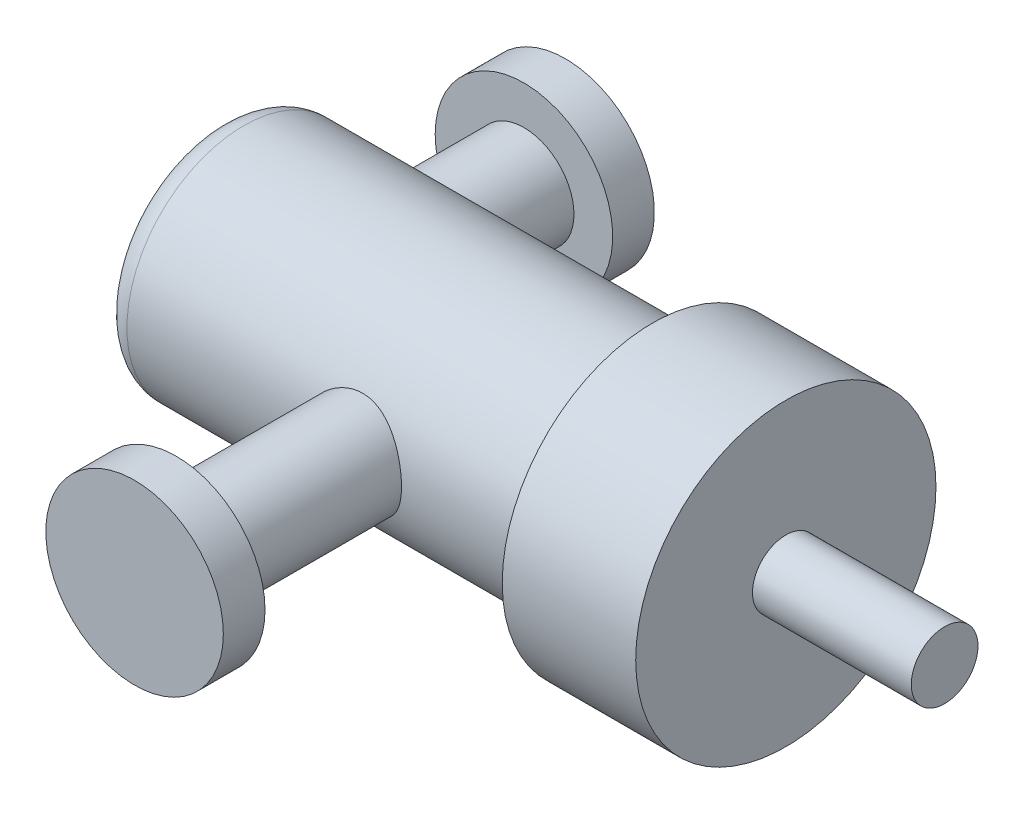
ISO-10303-21;
HEADER;
FILE_DESCRIPTION(('STEP AP214'),'2;1');
FILE_NAME('part.step','',(''),(''),'','','');
FILE_SCHEMA(('AUTOMOTIVE_DESIGN { 1 0 10303 214 1 1 1 1 }'));
ENDSEC;
DATA;
#1=APPLICATION_CONTEXT('core data for automotive mechanical design processes');
#2=APPLICATION_PROTOCOL_DEFINITION('international standard','automotive_design',2000,#1);
#3=PRODUCT_CONTEXT('',#1,'mechanical');
#4=PRODUCT('Part','Part','',(#3));
#5=PRODUCT_RELATED_PRODUCT_CATEGORY('part','',(#4));
#6=PRODUCT_DEFINITION_FORMATION('','',#4);
#7=PRODUCT_DEFINITION_CONTEXT('part definition',#1,'design');
#8=PRODUCT_DEFINITION('design','',#6,#7);
#9=PRODUCT_DEFINITION_SHAPE('','',#8);
#10=(LENGTH_UNIT() NAMED_UNIT(*) SI_UNIT(.MILLI.,.METRE.));
#11=(NAMED_UNIT(*) PLANE_ANGLE_UNIT() SI_UNIT($,.RADIAN.));
#12=(NAMED_UNIT(*) SI_UNIT($,.STERADIAN.) SOLID_ANGLE_UNIT());
#13=UNCERTAINTY_MEASURE_WITH_UNIT(LENGTH_MEASURE(1.E-05),#10,'distance_accuracy_value','');
#14=(GEOMETRIC_REPRESENTATION_CONTEXT(3) GLOBAL_UNCERTAINTY_ASSIGNED_CONTEXT((#13)) GLOBAL_UNIT_ASSIGNED_CONTEXT((#10,
#11,#12)) REPRESENTATION_CONTEXT('',''));
#15=CARTESIAN_POINT('',(0.,0.,0.));
#16=DIRECTION('',(0.,0.,1.));
#17=DIRECTION('',(1.,0.,0.));
#18=AXIS2_PLACEMENT_3D('',#15,#16,#17);
#19=CARTESIAN_POINT('',(107.95,0.,0.));
#20=DIRECTION('',(1.,0.,0.));
#21=DIRECTION('',(0.,0.,-1.));
#22=AXIS2_PLACEMENT_3D('',#19,#20,#21);
#23=PLANE('',#22);
#24=CARTESIAN_POINT('',(107.95,0.,0.));
#25=DIRECTION('',(1.,0.,0.));
#26=DIRECTION('',(0.,0.,-1.));
#27=AXIS2_PLACEMENT_3D('',#24,#25,#26);
#28=CIRCLE('',#27,28.575);
#29=CARTESIAN_POINT('',(107.95,0.,-28.575));
#30=VERTEX_POINT('',#29);
#31=EDGE_CURVE('E150',#30,#30,#28,.T.);
#32=ORIENTED_EDGE('',*,*,#31,.T.);
#33=EDGE_LOOP('',(#32));
#34=FACE_BOUND('',#33,.T.);
#35=CARTESIAN_POINT('',(107.95,0.,0.));
#36=DIRECTION('',(1.,0.,0.));
#37=DIRECTION('',(0.,0.,-1.));
#38=AXIS2_PLACEMENT_3D('',#35,#36,#37);
#39=CIRCLE('',#38,6.35);
#40=CARTESIAN_POINT('',(107.95,0.,-6.35));
#41=VERTEX_POINT('',#40);
#42=EDGE_CURVE('E156',#41,#41,#39,.T.);
#43=ORIENTED_EDGE('',*,*,#42,.F.);
#44=EDGE_LOOP('',(#43));
#45=FACE_BOUND('',#44,.T.);
#46=ADVANCED_FACE('F34',(#34,#45),#23,.T.);
#47=CARTESIAN_POINT('',(47.498,0.,63.5));
#48=DIRECTION('',(0.,0.,-1.));
#49=DIRECTION('',(-1.,0.,0.));
#50=AXIS2_PLACEMENT_3D('',#47,#48,#49);
#51=CYLINDRICAL_SURFACE('',#50,9.525);
#52=CARTESIAN_POINT('',(57.023,0.,22.225));
#53=CARTESIAN_POINT('',(57.0229981598876,0.254577345100235,22.2249984976709));
#54=CARTESIAN_POINT('',(57.0127801313092,0.509231836340834,22.2206141148735));
#55=CARTESIAN_POINT('',(56.9720053257292,1.01671931815165,22.203185510387));
#56=CARTESIAN_POINT('',(56.9414362052946,1.2695511090784,22.1901360331194));
#57=CARTESIAN_POINT('',(56.8601948405147,1.77195201286189,22.1556840534413));
#58=CARTESIAN_POINT('',(56.8094794728722,2.02151293290386,22.1342636345313));
#59=CARTESIAN_POINT('',(56.6884713536533,2.5150403418331,22.0836307566389));
#60=CARTESIAN_POINT('',(56.6181772303803,2.75900643744772,22.0544177517102));
#61=CARTESIAN_POINT('',(56.4589817498151,3.23884240555854,21.9890642856473));
#62=CARTESIAN_POINT('',(56.3701477009243,3.47473806715476,21.9529489221292));
#63=CARTESIAN_POINT('',(56.1745080793139,3.93789846161123,21.8746145476076));
#64=CARTESIAN_POINT('',(56.067701900429,4.16516290304002,21.8323953307397));
#65=CARTESIAN_POINT('',(55.8370225220207,4.60966122288925,21.7428839181145));
#66=CARTESIAN_POINT('',(55.7131584784401,4.82690039948816,21.6955944468514));
#67=CARTESIAN_POINT('',(55.4491999888498,5.25036877209389,21.5970278589244));
#68=CARTESIAN_POINT('',(55.309099591988,5.45659389058089,21.5457492824755));
#69=CARTESIAN_POINT('',(54.8516975226375,6.07620044321914,21.3826561744862));
#70=CARTESIAN_POINT('',(54.5082092716707,6.46940377335213,21.265985124966));
#71=CARTESIAN_POINT('',(53.7617064338627,7.19462425636197,21.0317315810915));
#72=CARTESIAN_POINT('',(53.3586590203785,7.5266074388468,20.9141486182071));
#73=CARTESIAN_POINT('',(52.7048747281929,7.98057846295993,20.7434098910974));
#74=CARTESIAN_POINT('',(52.4722721740756,8.12761810255565,20.6860875600207));
#75=CARTESIAN_POINT('',(51.9943663851262,8.40143224357953,20.5764013939119));
#76=CARTESIAN_POINT('',(51.7490684814007,8.52821516137206,20.5240355032585));
#77=CARTESIAN_POINT('',(51.2473263906018,8.76039906565493,20.4260111166721));
#78=CARTESIAN_POINT('',(50.990884401545,8.86580424557409,20.3803513057689));
#79=CARTESIAN_POINT('',(50.4685789707022,9.05418853455139,20.2973619874253));
#80=CARTESIAN_POINT('',(50.2027162782707,9.13716942280372,20.260031819133));
#81=CARTESIAN_POINT('',(49.6771246962922,9.27616247967744,20.1967565255241));
#82=CARTESIAN_POINT('',(49.417755305772,9.33331702916749,20.1703349009033));
#83=CARTESIAN_POINT('',(48.8943512485789,9.42583906382027,20.1272650609425));
#84=CARTESIAN_POINT('',(48.6303167336673,9.46120725637827,20.1106165282746));
#85=CARTESIAN_POINT('',(48.0998974558609,9.50969154052058,20.0877354134886));
#86=CARTESIAN_POINT('',(47.833513970977,9.52281906226094,20.0814974810715));
#87=CARTESIAN_POINT('',(47.3005555303223,9.52668058507953,20.0796661376385));
#88=CARTESIAN_POINT('',(47.0339805864087,9.51741587040486,20.0840721161695));
#89=CARTESIAN_POINT('',(46.5248076190435,9.47830468616798,20.1025563551881));
#90=CARTESIAN_POINT('',(46.2820420425753,9.45021502327381,20.1158086612906));
#91=CARTESIAN_POINT('',(45.7998914734426,9.37558420362904,20.1507007912001));
#92=CARTESIAN_POINT('',(45.5605076670297,9.3290367309335,20.1723434859971));
#93=CARTESIAN_POINT('',(45.0868518286518,9.2179798961228,20.2233329440359));
#94=CARTESIAN_POINT('',(44.8525786386024,9.15347464987045,20.2526779418471));
#95=CARTESIAN_POINT('',(44.3904234983301,9.0070736788677,20.3182104438385));
#96=CARTESIAN_POINT('',(44.162544098695,8.92517112264113,20.3544006353368));
#97=CARTESIAN_POINT('',(43.7097477651431,8.74274638673781,20.4334308223739));
#98=CARTESIAN_POINT('',(43.4849981348212,8.64186379389639,20.4763963682492));
#99=CARTESIAN_POINT('',(43.0446765249579,8.4234177815615,20.5672226820929));
#100=CARTESIAN_POINT('',(42.8291085558861,8.30584716808389,20.6150855587387));
#101=CARTESIAN_POINT('',(42.4082755882413,8.0548348647171,20.7144508942677));
#102=CARTESIAN_POINT('',(42.2030117006335,7.92139146866058,20.7659537441701));
#103=CARTESIAN_POINT('',(41.8037507611452,7.63942979274505,20.8713293284911));
#104=CARTESIAN_POINT('',(41.6097543790627,7.49091061814381,20.9252022034621));
#105=CARTESIAN_POINT('',(41.2169613432081,7.1655385880522,21.0389636535959));
#106=CARTESIAN_POINT('',(41.0193090351316,6.98733844534139,21.0989566595825));
#107=CARTESIAN_POINT('',(40.6396144595621,6.61504701809701,21.2186237262452));
#108=CARTESIAN_POINT('',(40.4575673576453,6.42096069172328,21.2782978802893));
#109=CARTESIAN_POINT('',(40.1099779167342,6.0177769554447,21.3958196358901));
#110=CARTESIAN_POINT('',(39.9444463604785,5.80866988997216,21.4536660275086));
#111=CARTESIAN_POINT('',(39.6311794456057,5.37679209119691,21.5659567077144));
#112=CARTESIAN_POINT('',(39.4834369538605,5.15402688902874,21.6204023557021));
#113=CARTESIAN_POINT('',(39.2031628752901,4.69005834453087,21.7258376483435));
#114=CARTESIAN_POINT('',(39.0711270236132,4.4485260868236,21.7767005279232));
#115=CARTESIAN_POINT('',(38.8280273797878,3.9538765841889,21.8719206341912));
#116=CARTESIAN_POINT('',(38.7169641758961,3.70075901455517,21.916277678391));
#117=CARTESIAN_POINT('',(38.5169704601581,3.18484437581147,21.9971709006075));
#118=CARTESIAN_POINT('',(38.4280294976095,2.9220519447907,22.0337107703668));
#119=CARTESIAN_POINT('',(38.2732068107432,2.38870331878187,22.0978921750844));
#120=CARTESIAN_POINT('',(38.2073232189149,2.11814775448312,22.1255344306823));
#121=CARTESIAN_POINT('',(38.1029762720266,1.58960557156667,22.1695600153487));
#122=CARTESIAN_POINT('',(38.0629874798613,1.33197127547685,22.1865671173913));
#123=CARTESIAN_POINT('',(38.0042538567344,0.813860838996018,22.2116074457352));
#124=CARTESIAN_POINT('',(37.9855080917744,0.55338482405613,22.219641066576));
#125=CARTESIAN_POINT('',(37.9694796084747,0.0317225200958138,22.2265078037208));
#126=CARTESIAN_POINT('',(37.9721911848614,-0.229463561663167,22.2253433656889));
#127=CARTESIAN_POINT('',(37.9990323075701,-0.750525640985261,22.2138524096962));
#128=CARTESIAN_POINT('',(38.0231613256687,-1.01040167069952,22.2035261176964));
#129=CARTESIAN_POINT('',(38.0906988320747,-1.51298642901184,22.174792926014));
#130=CARTESIAN_POINT('',(38.1330081184563,-1.75587041617462,22.1568473435797));
#131=CARTESIAN_POINT('',(38.2361588842577,-2.23707242061374,22.1134463928431));
#132=CARTESIAN_POINT('',(38.2970067994619,-2.47538882164104,22.0879884166696));
#133=CARTESIAN_POINT('',(38.4366383867895,-2.94576388456941,22.0301892809545));
#134=CARTESIAN_POINT('',(38.5154167371658,-3.17782438041034,21.9978501639182));
#135=CARTESIAN_POINT('',(38.6902689623302,-3.6344598988614,21.9270321115394));
#136=CARTESIAN_POINT('',(38.7863494305959,-3.85903202900991,21.8885508361856));
#137=CARTESIAN_POINT('',(38.9982493446888,-4.30615164232958,21.8050679589534));
#138=CARTESIAN_POINT('',(39.1145861593069,-4.52842309197479,21.7599018695429));
#139=CARTESIAN_POINT('',(39.3639781942652,-4.96245777744652,21.6650411970381));
#140=CARTESIAN_POINT('',(39.497039126056,-5.17421738874868,21.6153450684915));
#141=CARTESIAN_POINT('',(39.7789821014175,-5.58611566352709,21.5125778192692));
#142=CARTESIAN_POINT('',(39.927867086611,-5.78625215558512,21.4595060718196));
#143=CARTESIAN_POINT('',(40.2405475882472,-6.17389890643315,21.3512085516872));
#144=CARTESIAN_POINT('',(40.4043438042907,-6.36140857208271,21.2959826780073));
#145=CARTESIAN_POINT('',(40.7588861312715,-6.73658079307184,21.1804269973519));
#146=CARTESIAN_POINT('',(40.9507335532887,-6.92318253117317,21.1200270482741));
#147=CARTESIAN_POINT('',(41.3494824562479,-7.27961891331308,20.999836806299));
#148=CARTESIAN_POINT('',(41.5563794155562,-7.44945855767441,20.9400463363889));
#149=CARTESIAN_POINT('',(41.9842923189915,-7.77151231666634,20.8226708365103));
#150=CARTESIAN_POINT('',(42.2053177057586,-7.92371444817573,20.7650873235447));
#151=CARTESIAN_POINT('',(42.660050673828,-8.20925809211742,20.6538660313423));
#152=CARTESIAN_POINT('',(42.8937529117571,-8.34260746693262,20.6002266117602));
#153=CARTESIAN_POINT('',(43.3770227910215,-8.59176543392749,20.4975777213379));
#154=CARTESIAN_POINT('',(43.6268041142272,-8.70720339513866,20.4486724061742));
#155=CARTESIAN_POINT('',(44.1364806741484,-8.91636975821758,20.3583388702762));
#156=CARTESIAN_POINT('',(44.3963711542931,-9.01010822921826,20.3169071835606));
#157=CARTESIAN_POINT('',(44.924366908504,-9.17488288898897,20.2430311548956));
#158=CARTESIAN_POINT('',(45.1924679981835,-9.24593043752307,20.210582316947));
#159=CARTESIAN_POINT('',(45.7348417713061,-9.36450372755288,20.1559166667541));
#160=CARTESIAN_POINT('',(46.0091138227968,-9.41203186625243,20.1336988117381));
#161=CARTESIAN_POINT('',(46.5391934495212,-9.48007759376473,20.1017421844392));
#162=CARTESIAN_POINT('',(46.7947111045905,-9.50246075289932,20.0911431841064));
#163=CARTESIAN_POINT('',(47.3069328225873,-9.52653362978565,20.0797402115793));
#164=CARTESIAN_POINT('',(47.5636368183469,-9.5282245050701,20.0789356914788));
#165=CARTESIAN_POINT('',(48.0761413750291,-9.5108944251144,20.087150131806));
#166=CARTESIAN_POINT('',(48.3319420717628,-9.49187672912466,20.0961675463935));
#167=CARTESIAN_POINT('',(48.8406679647137,-9.43336748988536,20.1236985804831));
#168=CARTESIAN_POINT('',(49.0935931924788,-9.39387617148279,20.1422120956963));
#169=CARTESIAN_POINT('',(49.5815288531891,-9.29747847692058,20.1868812655067));
#170=CARTESIAN_POINT('',(49.8167836396942,-9.24159285691129,20.2125857390539));
#171=CARTESIAN_POINT('',(50.2816165833845,-9.11237161867512,20.2711701148483));
#172=CARTESIAN_POINT('',(50.5111927610368,-9.03903000744333,20.3040524810935));
#173=CARTESIAN_POINT('',(50.9632325461581,-8.87555917402661,20.3760408634517));
#174=CARTESIAN_POINT('',(51.1856971626638,-8.78543234594051,20.4151459918877));
#175=CARTESIAN_POINT('',(51.622466835722,-8.58904875923913,20.4985425038634));
#176=CARTESIAN_POINT('',(51.8367688791404,-8.48278611505882,20.5428357784344));
#177=CARTESIAN_POINT('',(52.2690678093215,-8.24783230260375,20.6383366726372));
#178=CARTESIAN_POINT('',(52.4864752450788,-8.11816117097671,20.6898023892325));
#179=CARTESIAN_POINT('',(52.9097590990994,-7.84234087586593,20.7959165320587));
#180=CARTESIAN_POINT('',(53.1156347787221,-7.69619065865412,20.8505651617075));
#181=CARTESIAN_POINT('',(53.5149398213824,-7.3882110161672,20.9616737895245));
#182=CARTESIAN_POINT('',(53.7083633898418,-7.22637437775529,21.0181346129414));
#183=CARTESIAN_POINT('',(54.081655967362,-6.88800016348071,21.1314434550974));
#184=CARTESIAN_POINT('',(54.2615288493289,-6.71146681866442,21.188291358102));
#185=CARTESIAN_POINT('',(54.6205816025451,-6.32996084191618,21.3055187170126));
#186=CARTESIAN_POINT('',(54.7985727332738,-6.12384306407621,21.3658202389022));
#187=CARTESIAN_POINT('',(55.1365423624209,-5.69670430755617,21.4836507011732));
#188=CARTESIAN_POINT('',(55.2965266754314,-5.47568817678467,21.5411805331105));
#189=CARTESIAN_POINT('',(55.5974939389305,-5.01980802755932,21.6519561854363));
#190=CARTESIAN_POINT('',(55.7384631096604,-4.78493414205639,21.7051988879157));
#191=CARTESIAN_POINT('',(56.0000835799014,-4.30294956921385,21.8058671718039));
#192=CARTESIAN_POINT('',(56.1207365021567,-4.05583986124303,21.8532932177313));
#193=CARTESIAN_POINT('',(56.339017336795,-3.55466719730918,21.9403444036917));
#194=CARTESIAN_POINT('',(56.4369523186661,-3.30075598897796,21.9800722162716));
#195=CARTESIAN_POINT('',(56.6109896974928,-2.78446294292978,22.0514234494277));
#196=CARTESIAN_POINT('',(56.6870943868286,-2.52208199783411,22.0830477209126));
#197=CARTESIAN_POINT('',(56.8164559357797,-1.99157300792885,22.1371899415471));
#198=CARTESIAN_POINT('',(56.8697726609288,-1.72346198884073,22.1597317419171));
#199=CARTESIAN_POINT('',(56.9531781867235,-1.18315492450111,22.1951335858129));
#200=CARTESIAN_POINT('',(56.9832836497787,-0.910961952880557,22.2080005743232));
#201=CARTESIAN_POINT('',(57.0087391564499,-0.531790738544622,22.2188913791789));
#202=CARTESIAN_POINT('',(57.0140852804769,-0.425520985102562,22.2211806492215));
#203=CARTESIAN_POINT('',(57.0212160979164,-0.212838649197289,22.2242352783781));
#204=CARTESIAN_POINT('',(57.023000769259,-0.106426065853063,22.2250006280487));
#205=CARTESIAN_POINT('',(57.023,0.,22.225));
#206=B_SPLINE_CURVE_WITH_KNOTS('',3,(#52,#53,#54,#55,#56,#57,#58,#59,#60,#61,#62,#63,#64,#65,
#66,#67,#68,#69,#70,#71,#72,#73,#74,#75,#76,#77,#78,#79,#80,#81,#82,#83,#84,#85,#86,#87,#88,#89,
#90,#91,#92,#93,#94,#95,#96,#97,#98,#99,#100,#101,#102,#103,#104,#105,#106,#107,#108,#109,#110,
#111,#112,#113,#114,#115,#116,#117,#118,#119,#120,#121,#122,#123,#124,#125,#126,#127,#128,#129,
#130,#131,#132,#133,#134,#135,#136,#137,#138,#139,#140,#141,#142,#143,#144,#145,#146,#147,#148,
#149,#150,#151,#152,#153,#154,#155,#156,#157,#158,#159,#160,#161,#162,#163,#164,#165,#166,#167,
#168,#169,#170,#171,#172,#173,#174,#175,#176,#177,#178,#179,#180,#181,#182,#183,#184,#185,#186,
#187,#188,#189,#190,#191,#192,#193,#194,#195,#196,#197,#198,#199,#200,#201,#202,#203,#204,#205),
.UNSPECIFIED.,.T.,.F.,(4,2,2,2,2,2,2,2,2,2,2,2,2,2,2,2,2,2,2,2,2,2,2,2,2,2,2,2,2,2,2,2,2,2,2,2,
2,2,2,2,2,2,2,2,2,2,2,2,2,2,2,2,2,2,2,2,2,2,2,2,2,2,2,2,2,2,2,2,2,2,2,2,2,2,2,2,4),(0.,
0.763624393736623,1.52771236674624,2.2934447696876,3.05923083369647,3.82228365522136,
4.5853622182107,5.34803277772867,6.11098375608855,7.7085701785425,9.30704043420028,
10.1494076425582,10.9914239446846,11.8332749179159,12.6750590771564,13.4746910174646,
14.274296992639,15.0734919012266,15.8726409752057,16.6060137310483,17.3396376512793,
18.0730935655482,18.8068380232766,19.5562584661832,20.3060029610501,21.0558281189954,
21.8056978048521,22.6231801001926,23.440408220913,24.258166452686,25.0755956767932,
25.9142915451947,26.7530109344813,27.5913333510747,28.4295878527875,29.212397047182,
29.9951718222396,30.7777384729933,31.5602858236623,32.3010138948531,33.0419994073366,
33.7827652816858,34.5238140462014,35.287716829417,36.0518812054318,36.81618788557,
37.5805304437191,38.4026760115282,39.2245755779369,40.0470303180768,40.8691410421926,
41.7064786509323,42.5434269306935,43.3799555495655,44.216398888115,44.9855424408765,
45.7546429673146,46.5236224651743,47.2925935180674,48.0212785708527,48.7502141581615,
49.4790458558873,50.2081440375789,50.9822787733913,51.7564630380812,52.5310050026749,
53.3053247497973,54.1411183932636,54.9766413710962,55.8127666137242,56.6488250398033,
57.4728216437662,58.2967316888529,59.1184637599417,59.9396053927514,60.2588366125126,
60.5780698105131),.UNSPECIFIED.);
#207=CARTESIAN_POINT('',(57.023,0.,22.225));
#208=VERTEX_POINT('',#207);
#209=EDGE_CURVE('E50',#208,#208,#206,.T.);
#210=ORIENTED_EDGE('',*,*,#209,.T.);
#211=EDGE_LOOP('',(#210));
#212=FACE_BOUND('',#211,.T.);
#213=CARTESIAN_POINT('',(47.498,0.,55.5625));
#214=DIRECTION('',(0.,0.,1.));
#215=DIRECTION('',(1.,0.,0.));
#216=AXIS2_PLACEMENT_3D('',#213,#214,#215);
#217=CIRCLE('',#216,9.525);
#218=CARTESIAN_POINT('',(57.023,0.,55.5625));
#219=VERTEX_POINT('',#218);
#220=EDGE_CURVE('E46',#219,#219,#217,.T.);
#221=ORIENTED_EDGE('',*,*,#220,.F.);
#222=EDGE_LOOP('',(#221));
#223=FACE_BOUND('',#222,.T.);
#224=ADVANCED_FACE('F73',(#212,#223),#51,.T.);
#225=CARTESIAN_POINT('',(19.05,0.,-46.99));
#226=DIRECTION('',(0.,0.,1.));
#227=DIRECTION('',(1.,0.,0.));
#228=AXIS2_PLACEMENT_3D('',#225,#226,#227);
#229=CYLINDRICAL_SURFACE('',#228,9.525);
#230=CARTESIAN_POINT('',(28.575,0.,-22.225));
#231=CARTESIAN_POINT('',(28.5749981598876,0.254577345100235,-22.2249984976709));
#232=CARTESIAN_POINT('',(28.5647801313092,0.509231836340835,-22.2206141148735));
#233=CARTESIAN_POINT('',(28.5240053257292,1.01671931815165,-22.203185510387));
#234=CARTESIAN_POINT('',(28.4934362052946,1.2695511090784,-22.1901360331194));
#235=CARTESIAN_POINT('',(28.4121948405147,1.77195201286189,-22.1556840534413));
#236=CARTESIAN_POINT('',(28.3614794728722,2.02151293290386,-22.1342636345313));
#237=CARTESIAN_POINT('',(28.2404713536533,2.5150403418331,-22.0836307566389));
#238=CARTESIAN_POINT('',(28.1701772303803,2.75900643744772,-22.0544177517102));
#239=CARTESIAN_POINT('',(28.0109817498151,3.23884240555854,-21.9890642856473));
#240=CARTESIAN_POINT('',(27.9221477009243,3.47473806715476,-21.9529489221292));
#241=CARTESIAN_POINT('',(27.7265080793139,3.93789846161123,-21.8746145476076));
#242=CARTESIAN_POINT('',(27.619701900429,4.16516290304002,-21.8323953307397));
#243=CARTESIAN_POINT('',(27.3890225220207,4.60966122288925,-21.7428839181145));
#244=CARTESIAN_POINT('',(27.2651584784401,4.82690039948816,-21.6955944468514));
#245=CARTESIAN_POINT('',(27.0011999888498,5.2503687720939,-21.5970278589244));
#246=CARTESIAN_POINT('',(26.8610995919879,5.45659389058089,-21.5457492824755));
#247=CARTESIAN_POINT('',(26.4036975226375,6.07620044321914,-21.3826561744862));
#248=CARTESIAN_POINT('',(26.0602092716707,6.46940377335213,-21.265985124966));
#249=CARTESIAN_POINT('',(25.3137064338627,7.19462425636198,-21.0317315810915));
#250=CARTESIAN_POINT('',(24.9106590203785,7.52660743884681,-20.9141486182071));
#251=CARTESIAN_POINT('',(24.2568747281929,7.98057846295994,-20.7434098910974));
#252=CARTESIAN_POINT('',(24.0242721740756,8.12761810255566,-20.6860875600207));
#253=CARTESIAN_POINT('',(23.5463663851262,8.40143224357953,-20.5764013939119));
#254=CARTESIAN_POINT('',(23.3010684814007,8.52821516137207,-20.5240355032585));
#255=CARTESIAN_POINT('',(22.7993263906018,8.76039906565493,-20.4260111166721));
#256=CARTESIAN_POINT('',(22.5428844015449,8.86580424557409,-20.3803513057689));
#257=CARTESIAN_POINT('',(22.0205789707022,9.05418853455139,-20.2973619874253));
#258=CARTESIAN_POINT('',(21.7547162782707,9.13716942280372,-20.260031819133));
#259=CARTESIAN_POINT('',(21.2291246962922,9.27616247967743,-20.1967565255241));
#260=CARTESIAN_POINT('',(20.969755305772,9.33331702916749,-20.1703349009033));
#261=CARTESIAN_POINT('',(20.4463512485789,9.42583906382027,-20.1272650609425));
#262=CARTESIAN_POINT('',(20.1823167336673,9.46120725637827,-20.1106165282746));
#263=CARTESIAN_POINT('',(19.6518974558609,9.50969154052059,-20.0877354134886));
#264=CARTESIAN_POINT('',(19.385513970977,9.52281906226094,-20.0814974810715));
#265=CARTESIAN_POINT('',(18.8525555303223,9.52668058507953,-20.0796661376385));
#266=CARTESIAN_POINT('',(18.5859805864087,9.51741587040486,-20.0840721161695));
#267=CARTESIAN_POINT('',(18.0768076190435,9.47830468616798,-20.1025563551881));
#268=CARTESIAN_POINT('',(17.8340420425753,9.45021502327381,-20.1158086612906));
#269=CARTESIAN_POINT('',(17.3518914734426,9.37558420362904,-20.1507007912001));
#270=CARTESIAN_POINT('',(17.1125076670297,9.3290367309335,-20.1723434859971));
#271=CARTESIAN_POINT('',(16.6388518286518,9.2179798961228,-20.2233329440359));
#272=CARTESIAN_POINT('',(16.4045786386024,9.15347464987045,-20.2526779418471));
#273=CARTESIAN_POINT('',(15.9424234983301,9.0070736788677,-20.3182104438385));
#274=CARTESIAN_POINT('',(15.714544098695,8.92517112264113,-20.3544006353368));
#275=CARTESIAN_POINT('',(15.2617477651431,8.74274638673781,-20.4334308223739));
#276=CARTESIAN_POINT('',(15.0369981348212,8.64186379389639,-20.4763963682492));
#277=CARTESIAN_POINT('',(14.5966765249579,8.42341778156151,-20.5672226820929));
#278=CARTESIAN_POINT('',(14.3811085558861,8.3058471680839,-20.6150855587387));
#279=CARTESIAN_POINT('',(13.9602755882413,8.0548348647171,-20.7144508942677));
#280=CARTESIAN_POINT('',(13.7550117006335,7.92139146866059,-20.7659537441701));
#281=CARTESIAN_POINT('',(13.3557507611452,7.63942979274506,-20.8713293284911));
#282=CARTESIAN_POINT('',(13.1617543790627,7.49091061814382,-20.9252022034621));
#283=CARTESIAN_POINT('',(12.7689613432081,7.1655385880522,-21.0389636535959));
#284=CARTESIAN_POINT('',(12.5713090351316,6.9873384453414,-21.0989566595825));
#285=CARTESIAN_POINT('',(12.1916144595621,6.61504701809701,-21.2186237262452));
#286=CARTESIAN_POINT('',(12.0095673576453,6.42096069172328,-21.2782978802893));
#287=CARTESIAN_POINT('',(11.6619779167342,6.01777695544469,-21.3958196358901));
#288=CARTESIAN_POINT('',(11.4964463604785,5.80866988997216,-21.4536660275086));
#289=CARTESIAN_POINT('',(11.1831794456057,5.37679209119691,-21.5659567077144));
#290=CARTESIAN_POINT('',(11.0354369538605,5.15402688902874,-21.6204023557021));
#291=CARTESIAN_POINT('',(10.7551628752901,4.69005834453087,-21.7258376483435));
#292=CARTESIAN_POINT('',(10.6231270236132,4.44852608682361,-21.7767005279232));
#293=CARTESIAN_POINT('',(10.3800273797878,3.9538765841889,-21.8719206341912));
#294=CARTESIAN_POINT('',(10.2689641758961,3.70075901455517,-21.916277678391));
#295=CARTESIAN_POINT('',(10.0689704601581,3.18484437581147,-21.9971709006075));
#296=CARTESIAN_POINT('',(9.98002949760952,2.9220519447907,-22.0337107703668));
#297=CARTESIAN_POINT('',(9.82520681074323,2.38870331878187,-22.0978921750844));
#298=CARTESIAN_POINT('',(9.75932321891488,2.11814775448312,-22.1255344306823));
#299=CARTESIAN_POINT('',(9.65497627202657,1.58960557156667,-22.1695600153487));
#300=CARTESIAN_POINT('',(9.6149874798613,1.33197127547685,-22.1865671173913));
#301=CARTESIAN_POINT('',(9.55625385673441,0.81386083899602,-22.2116074457352));
#302=CARTESIAN_POINT('',(9.53750809177438,0.553384824056131,-22.219641066576));
#303=CARTESIAN_POINT('',(9.52147960847473,0.0317225200958146,-22.2265078037208));
#304=CARTESIAN_POINT('',(9.52419118486145,-0.229463561663166,-22.2253433656889));
#305=CARTESIAN_POINT('',(9.55103230757008,-0.75052564098526,-22.2138524096962));
#306=CARTESIAN_POINT('',(9.57516132566873,-1.01040167069952,-22.2035261176964));
#307=CARTESIAN_POINT('',(9.64269883207468,-1.51298642901184,-22.174792926014));
#308=CARTESIAN_POINT('',(9.68500811845632,-1.75587041617462,-22.1568473435797));
#309=CARTESIAN_POINT('',(9.78815888425772,-2.23707242061374,-22.1134463928431));
#310=CARTESIAN_POINT('',(9.84900679946185,-2.47538882164104,-22.0879884166696));
#311=CARTESIAN_POINT('',(9.98863838678952,-2.94576388456941,-22.0301892809545));
#312=CARTESIAN_POINT('',(10.0674167371658,-3.17782438041034,-21.9978501639182));
#313=CARTESIAN_POINT('',(10.2422689623302,-3.6344598988614,-21.9270321115394));
#314=CARTESIAN_POINT('',(10.3383494305959,-3.85903202900991,-21.8885508361856));
#315=CARTESIAN_POINT('',(10.5502493446888,-4.30615164232958,-21.8050679589534));
#316=CARTESIAN_POINT('',(10.6665861593069,-4.52842309197479,-21.7599018695429));
#317=CARTESIAN_POINT('',(10.9159781942652,-4.96245777744652,-21.6650411970381));
#318=CARTESIAN_POINT('',(11.049039126056,-5.17421738874868,-21.6153450684915));
#319=CARTESIAN_POINT('',(11.3309821014175,-5.58611566352709,-21.5125778192692));
#320=CARTESIAN_POINT('',(11.479867086611,-5.78625215558512,-21.4595060718196));
#321=CARTESIAN_POINT('',(11.7925475882472,-6.17389890643315,-21.3512085516872));
#322=CARTESIAN_POINT('',(11.9563438042907,-6.36140857208271,-21.2959826780073));
#323=CARTESIAN_POINT('',(12.3108861312715,-6.73658079307184,-21.1804269973519));
#324=CARTESIAN_POINT('',(12.5027335532887,-6.92318253117317,-21.1200270482741));
#325=CARTESIAN_POINT('',(12.9014824562479,-7.27961891331308,-20.999836806299));
#326=CARTESIAN_POINT('',(13.1083794155562,-7.44945855767441,-20.9400463363889));
#327=CARTESIAN_POINT('',(13.5362923189915,-7.77151231666633,-20.8226708365103));
#328=CARTESIAN_POINT('',(13.7573177057586,-7.92371444817573,-20.7650873235447));
#329=CARTESIAN_POINT('',(14.212050673828,-8.20925809211742,-20.6538660313423));
#330=CARTESIAN_POINT('',(14.4457529117571,-8.34260746693261,-20.6002266117602));
#331=CARTESIAN_POINT('',(14.9290227910215,-8.59176543392749,-20.4975777213379));
#332=CARTESIAN_POINT('',(15.1788041142272,-8.70720339513866,-20.4486724061742));
#333=CARTESIAN_POINT('',(15.6884806741484,-8.91636975821758,-20.3583388702762));
#334=CARTESIAN_POINT('',(15.9483711542931,-9.01010822921826,-20.3169071835606));
#335=CARTESIAN_POINT('',(16.476366908504,-9.17488288898897,-20.2430311548956));
#336=CARTESIAN_POINT('',(16.7444679981835,-9.24593043752307,-20.210582316947));
#337=CARTESIAN_POINT('',(17.2868417713061,-9.36450372755288,-20.1559166667541));
#338=CARTESIAN_POINT('',(17.5611138227968,-9.41203186625243,-20.1336988117381));
#339=CARTESIAN_POINT('',(18.0911934495212,-9.48007759376473,-20.1017421844392));
#340=CARTESIAN_POINT('',(18.3467111045905,-9.50246075289932,-20.0911431841064));
#341=CARTESIAN_POINT('',(18.8589328225873,-9.52653362978565,-20.0797402115793));
#342=CARTESIAN_POINT('',(19.1156368183468,-9.52822450507011,-20.0789356914788));
#343=CARTESIAN_POINT('',(19.6281413750291,-9.5108944251144,-20.087150131806));
#344=CARTESIAN_POINT('',(19.8839420717628,-9.49187672912466,-20.0961675463935));
#345=CARTESIAN_POINT('',(20.3926679647137,-9.43336748988536,-20.1236985804831));
#346=CARTESIAN_POINT('',(20.6455931924788,-9.39387617148279,-20.1422120956963));
#347=CARTESIAN_POINT('',(21.1335288531892,-9.29747847692058,-20.1868812655067));
#348=CARTESIAN_POINT('',(21.3687836396942,-9.24159285691129,-20.2125857390539));
#349=CARTESIAN_POINT('',(21.8336165833845,-9.11237161867512,-20.2711701148483));
#350=CARTESIAN_POINT('',(22.0631927610368,-9.03903000744332,-20.3040524810935));
#351=CARTESIAN_POINT('',(22.5152325461581,-8.8755591740266,-20.3760408634517));
#352=CARTESIAN_POINT('',(22.7376971626638,-8.78543234594051,-20.4151459918877));
#353=CARTESIAN_POINT('',(23.174466835722,-8.58904875923913,-20.4985425038634));
#354=CARTESIAN_POINT('',(23.3887688791404,-8.48278611505882,-20.5428357784344));
#355=CARTESIAN_POINT('',(23.8210678093215,-8.24783230260375,-20.6383366726372));
#356=CARTESIAN_POINT('',(24.0384752450788,-8.1181611709767,-20.6898023892325));
#357=CARTESIAN_POINT('',(24.4617590990994,-7.84234087586593,-20.7959165320587));
#358=CARTESIAN_POINT('',(24.6676347787221,-7.69619065865411,-20.8505651617075));
#359=CARTESIAN_POINT('',(25.0669398213824,-7.38821101616719,-20.9616737895245));
#360=CARTESIAN_POINT('',(25.2603633898418,-7.22637437775528,-21.0181346129414));
#361=CARTESIAN_POINT('',(25.633655967362,-6.8880001634807,-21.1314434550974));
#362=CARTESIAN_POINT('',(25.8135288493289,-6.71146681866442,-21.188291358102));
#363=CARTESIAN_POINT('',(26.1725816025451,-6.32996084191618,-21.3055187170126));
#364=CARTESIAN_POINT('',(26.3505727332738,-6.12384306407621,-21.3658202389022));
#365=CARTESIAN_POINT('',(26.6885423624209,-5.69670430755617,-21.4836507011732));
#366=CARTESIAN_POINT('',(26.8485266754314,-5.47568817678467,-21.5411805331105));
#367=CARTESIAN_POINT('',(27.1494939389305,-5.01980802755931,-21.6519561854363));
#368=CARTESIAN_POINT('',(27.2904631096604,-4.78493414205639,-21.7051988879157));
#369=CARTESIAN_POINT('',(27.5520835799014,-4.30294956921385,-21.8058671718039));
#370=CARTESIAN_POINT('',(27.6727365021567,-4.05583986124303,-21.8532932177313));
#371=CARTESIAN_POINT('',(27.891017336795,-3.55466719730918,-21.9403444036917));
#372=CARTESIAN_POINT('',(27.9889523186661,-3.30075598897796,-21.9800722162716));
#373=CARTESIAN_POINT('',(28.1629896974928,-2.78446294292977,-22.0514234494277));
#374=CARTESIAN_POINT('',(28.2390943868286,-2.52208199783411,-22.0830477209126));
#375=CARTESIAN_POINT('',(28.3684559357797,-1.99157300792885,-22.1371899415471));
#376=CARTESIAN_POINT('',(28.4217726609288,-1.72346198884072,-22.1597317419171));
#377=CARTESIAN_POINT('',(28.5051781867235,-1.18315492450111,-22.1951335858129));
#378=CARTESIAN_POINT('',(28.5352836497787,-0.910961952880554,-22.2080005743232));
#379=CARTESIAN_POINT('',(28.5607391564499,-0.531790738544621,-22.2188913791789));
#380=CARTESIAN_POINT('',(28.5660852804769,-0.425520985102561,-22.2211806492215));
#381=CARTESIAN_POINT('',(28.5732160979164,-0.212838649197289,-22.2242352783781));
#382=CARTESIAN_POINT('',(28.575000769259,-0.106426065853063,-22.2250006280487));
#383=CARTESIAN_POINT('',(28.575,0.,-22.225));
#384=B_SPLINE_CURVE_WITH_KNOTS('',3,(#230,#231,#232,#233,#234,#235,#236,#237,#238,#239,#240,
#241,#242,#243,#244,#245,#246,#247,#248,#249,#250,#251,#252,#253,#254,#255,#256,#257,#258,#259,
#260,#261,#262,#263,#264,#265,#266,#267,#268,#269,#270,#271,#272,#273,#274,#275,#276,#277,#278,
#279,#280,#281,#282,#283,#284,#285,#286,#287,#288,#289,#290,#291,#292,#293,#294,#295,#296,#297,
#298,#299,#300,#301,#302,#303,#304,#305,#306,#307,#308,#309,#310,#311,#312,#313,#314,#315,#316,
#317,#318,#319,#320,#321,#322,#323,#324,#325,#326,#327,#328,#329,#330,#331,#332,#333,#334,#335,
#336,#337,#338,#339,#340,#341,#342,#343,#344,#345,#346,#347,#348,#349,#350,#351,#352,#353,#354,
#355,#356,#357,#358,#359,#360,#361,#362,#363,#364,#365,#366,#367,#368,#369,#370,#371,#372,#373,
#374,#375,#376,#377,#378,#379,#380,#381,#382,#383),.UNSPECIFIED.,.T.,.F.,(4,2,2,2,2,2,2,2,2,2,2,
2,2,2,2,2,2,2,2,2,2,2,2,2,2,2,2,2,2,2,2,2,2,2,2,2,2,2,2,2,2,2,2,2,2,2,2,2,2,2,2,2,2,2,2,2,2,2,2,
2,2,2,2,2,2,2,2,2,2,2,2,2,2,2,2,2,4),(0.,0.763624393736623,1.52771236674624,2.2934447696876,
3.05923083369647,3.82228365522136,4.5853622182107,5.34803277772868,6.11098375608856,
7.70857017854251,9.30704043420028,10.1494076425583,10.9914239446846,11.8332749179159,
12.6750590771564,13.4746910174646,14.274296992639,15.0734919012266,15.8726409752057,
16.6060137310483,17.3396376512793,18.0730935655482,18.8068380232766,19.5562584661832,
20.30600296105,21.0558281189954,21.8056978048521,22.6231801001926,23.440408220913,
24.258166452686,25.0755956767932,25.9142915451947,26.7530109344813,27.5913333510747,
28.4295878527875,29.212397047182,29.9951718222396,30.7777384729933,31.5602858236623,
32.3010138948531,33.0419994073366,33.7827652816858,34.5238140462014,35.287716829417,
36.0518812054318,36.81618788557,37.5805304437191,38.4026760115282,39.2245755779369,
40.0470303180768,40.8691410421926,41.7064786509323,42.5434269306935,43.3799555495655,
44.216398888115,44.9855424408765,45.7546429673146,46.5236224651743,47.2925935180674,
48.0212785708527,48.7502141581615,49.4790458558873,50.2081440375789,50.9822787733914,
51.7564630380812,52.5310050026749,53.3053247497973,54.1411183932637,54.9766413710963,
55.8127666137243,56.6488250398033,57.4728216437662,58.296731688853,59.1184637599417,
59.9396053927514,60.2588366125126,60.5780698105131),.UNSPECIFIED.);
#385=CARTESIAN_POINT('',(28.575,0.,-22.225));
#386=VERTEX_POINT('',#385);
#387=EDGE_CURVE('E56',#386,#386,#384,.T.);
#388=ORIENTED_EDGE('',*,*,#387,.F.);
#389=EDGE_LOOP('',(#388));
#390=FACE_BOUND('',#389,.T.);
#391=CARTESIAN_POINT('',(19.05,0.,-39.0525));
#392=DIRECTION('',(0.,0.,-1.));
#393=DIRECTION('',(-1.,0.,0.));
#394=AXIS2_PLACEMENT_3D('',#391,#392,#393);
#395=CIRCLE('',#394,9.525);
#396=CARTESIAN_POINT('',(9.525,0.,-39.0525));
#397=VERTEX_POINT('',#396);
#398=EDGE_CURVE('E53',#397,#397,#395,.F.);
#399=ORIENTED_EDGE('',*,*,#398,.T.);
#400=EDGE_LOOP('',(#399));
#401=FACE_BOUND('',#400,.T.);
#402=ADVANCED_FACE('F68',(#390,#401),#229,.T.);
#403=CARTESIAN_POINT('',(82.55,0.,0.));
#404=DIRECTION('',(-1.,0.,0.));
#405=DIRECTION('',(0.,0.,1.));
#406=AXIS2_PLACEMENT_3D('',#403,#404,#405);
#407=CYLINDRICAL_SURFACE('',#406,22.225);
#408=CARTESIAN_POINT('',(4.7625,0.,0.));
#409=DIRECTION('',(1.,0.,0.));
#410=DIRECTION('',(0.,0.,-1.));
#411=AXIS2_PLACEMENT_3D('',#408,#409,#410);
#412=CIRCLE('',#411,22.225);
#413=CARTESIAN_POINT('',(4.7625,0.,-22.225));
#414=VERTEX_POINT('',#413);
#415=EDGE_CURVE('E42',#414,#414,#412,.T.);
#416=ORIENTED_EDGE('',*,*,#415,.T.);
#417=EDGE_LOOP('',(#416));
#418=FACE_BOUND('',#417,.T.);
#419=ORIENTED_EDGE('',*,*,#387,.T.);
#420=EDGE_LOOP('',(#419));
#421=FACE_BOUND('',#420,.T.);
#422=CARTESIAN_POINT('',(82.55,0.,0.));
#423=DIRECTION('',(1.,0.,0.));
#424=DIRECTION('',(0.,0.,-1.));
#425=AXIS2_PLACEMENT_3D('',#422,#423,#424);
#426=CIRCLE('',#425,22.225);
#427=CARTESIAN_POINT('',(82.55,0.,-22.225));
#428=VERTEX_POINT('',#427);
#429=EDGE_CURVE('E63',#428,#428,#426,.T.);
#430=ORIENTED_EDGE('',*,*,#429,.F.);
#431=EDGE_LOOP('',(#430));
#432=FACE_BOUND('',#431,.T.);
#433=ORIENTED_EDGE('',*,*,#209,.F.);
#434=EDGE_LOOP('',(#433));
#435=FACE_BOUND('',#434,.T.);
#436=ADVANCED_FACE('F36',(#418,#421,#432,#435),#407,.T.);
#437=CARTESIAN_POINT('',(0.,0.,0.));
#438=DIRECTION('',(1.,0.,0.));
#439=DIRECTION('',(0.,0.,-1.));
#440=AXIS2_PLACEMENT_3D('',#437,#438,#439);
#441=PLANE('',#440);
#442=CARTESIAN_POINT('',(0.,0.,0.));
#443=DIRECTION('',(1.,0.,0.));
#444=DIRECTION('',(0.,0.,-1.));
#445=AXIS2_PLACEMENT_3D('',#442,#443,#444);
#446=CIRCLE('',#445,17.4625);
#447=CARTESIAN_POINT('',(0.,0.,-17.4625));
#448=VERTEX_POINT('',#447);
#449=EDGE_CURVE('E10',#448,#448,#446,.F.);
#450=ORIENTED_EDGE('',*,*,#449,.T.);
#451=EDGE_LOOP('',(#450));
#452=FACE_BOUND('',#451,.T.);
#453=ADVANCED_FACE('F85',(#452),#441,.F.);
#454=CARTESIAN_POINT('',(19.05,0.,-39.0525));
#455=DIRECTION('',(0.,0.,-1.));
#456=DIRECTION('',(-1.,0.,0.));
#457=AXIS2_PLACEMENT_3D('',#454,#455,#456);
#458=CYLINDRICAL_SURFACE('',#457,16.891);
#459=CARTESIAN_POINT('',(19.05,0.,-39.0525));
#460=DIRECTION('',(0.,0.,-1.));
#461=DIRECTION('',(-1.,0.,0.));
#462=AXIS2_PLACEMENT_3D('',#459,#460,#461);
#463=CIRCLE('',#462,16.891);
#464=CARTESIAN_POINT('',(2.159,0.,-39.0525));
#465=VERTEX_POINT('',#464);
#466=EDGE_CURVE('E57',#465,#465,#463,.T.);
#467=ORIENTED_EDGE('',*,*,#466,.T.);
#468=EDGE_LOOP('',(#467));
#469=FACE_BOUND('',#468,.T.);
#470=CARTESIAN_POINT('',(19.05,0.,-46.99));
#471=DIRECTION('',(0.,0.,-1.));
#472=DIRECTION('',(-1.,0.,0.));
#473=AXIS2_PLACEMENT_3D('',#470,#471,#472);
#474=CIRCLE('',#473,16.891);
#475=CARTESIAN_POINT('',(2.159,0.,-46.99));
#476=VERTEX_POINT('',#475);
#477=EDGE_CURVE('E126',#476,#476,#474,.T.);
#478=ORIENTED_EDGE('',*,*,#477,.F.);
#479=EDGE_LOOP('',(#478));
#480=FACE_BOUND('',#479,.T.);
#481=ADVANCED_FACE('F87',(#469,#480),#458,.T.);
#482=CARTESIAN_POINT('',(19.05,0.,-39.0525));
#483=DIRECTION('',(0.,0.,-1.));
#484=DIRECTION('',(-1.,0.,0.));
#485=AXIS2_PLACEMENT_3D('',#482,#483,#484);
#486=PLANE('',#485);
#487=ORIENTED_EDGE('',*,*,#398,.F.);
#488=EDGE_LOOP('',(#487));
#489=FACE_BOUND('',#488,.T.);
#490=ORIENTED_EDGE('',*,*,#466,.F.);
#491=EDGE_LOOP('',(#490));
#492=FACE_BOUND('',#491,.T.);
#493=ADVANCED_FACE('F92',(#489,#492),#486,.F.);
#494=CARTESIAN_POINT('',(19.05,0.,-46.99));
#495=DIRECTION('',(0.,0.,1.));
#496=DIRECTION('',(1.,0.,0.));
#497=AXIS2_PLACEMENT_3D('',#494,#495,#496);
#498=PLANE('',#497);
#499=ORIENTED_EDGE('',*,*,#477,.T.);
#500=EDGE_LOOP('',(#499));
#501=FACE_BOUND('',#500,.T.);
#502=ADVANCED_FACE('F75',(#501),#498,.F.);
#503=CARTESIAN_POINT('',(47.498,0.,55.5625));
#504=DIRECTION('',(0.,0.,1.));
#505=DIRECTION('',(1.,0.,0.));
#506=AXIS2_PLACEMENT_3D('',#503,#504,#505);
#507=PLANE('',#506);
#508=CARTESIAN_POINT('',(47.498,0.,55.5625));
#509=DIRECTION('',(0.,0.,1.));
#510=DIRECTION('',(1.,0.,0.));
#511=AXIS2_PLACEMENT_3D('',#508,#509,#510);
#512=CIRCLE('',#511,16.891);
#513=CARTESIAN_POINT('',(64.389,0.,55.5625));
#514=VERTEX_POINT('',#513);
#515=EDGE_CURVE('E129',#514,#514,#512,.T.);
#516=ORIENTED_EDGE('',*,*,#515,.F.);
#517=EDGE_LOOP('',(#516));
#518=FACE_BOUND('',#517,.T.);
#519=ORIENTED_EDGE('',*,*,#220,.T.);
#520=EDGE_LOOP('',(#519));
#521=FACE_BOUND('',#520,.T.);
#522=ADVANCED_FACE('F109',(#518,#521),#507,.F.);
#523=CARTESIAN_POINT('',(47.498,0.,55.5625));
#524=DIRECTION('',(0.,0.,1.));
#525=DIRECTION('',(1.,0.,0.));
#526=AXIS2_PLACEMENT_3D('',#523,#524,#525);
#527=CYLINDRICAL_SURFACE('',#526,16.891);
#528=ORIENTED_EDGE('',*,*,#515,.T.);
#529=EDGE_LOOP('',(#528));
#530=FACE_BOUND('',#529,.T.);
#531=CARTESIAN_POINT('',(47.498,0.,63.5));
#532=DIRECTION('',(0.,0.,1.));
#533=DIRECTION('',(1.,0.,0.));
#534=AXIS2_PLACEMENT_3D('',#531,#532,#533);
#535=CIRCLE('',#534,16.891);
#536=CARTESIAN_POINT('',(64.389,0.,63.5));
#537=VERTEX_POINT('',#536);
#538=EDGE_CURVE('E153',#537,#537,#535,.T.);
#539=ORIENTED_EDGE('',*,*,#538,.F.);
#540=EDGE_LOOP('',(#539));
#541=FACE_BOUND('',#540,.T.);
#542=ADVANCED_FACE('F80',(#530,#541),#527,.T.);
#543=CARTESIAN_POINT('',(47.498,0.,63.5));
#544=DIRECTION('',(0.,0.,1.));
#545=DIRECTION('',(1.,0.,0.));
#546=AXIS2_PLACEMENT_3D('',#543,#544,#545);
#547=PLANE('',#546);
#548=ORIENTED_EDGE('',*,*,#538,.T.);
#549=EDGE_LOOP('',(#548));
#550=FACE_BOUND('',#549,.T.);
#551=ADVANCED_FACE('F77',(#550),#547,.T.);
#552=CARTESIAN_POINT('',(82.55,0.,0.));
#553=DIRECTION('',(1.,0.,0.));
#554=DIRECTION('',(0.,0.,-1.));
#555=AXIS2_PLACEMENT_3D('',#552,#553,#554);
#556=PLANE('',#555);
#557=CARTESIAN_POINT('',(82.55,0.,0.));
#558=DIRECTION('',(1.,0.,0.));
#559=DIRECTION('',(0.,0.,-1.));
#560=AXIS2_PLACEMENT_3D('',#557,#558,#559);
#561=CIRCLE('',#560,28.575);
#562=CARTESIAN_POINT('',(82.55,0.,-28.575));
#563=VERTEX_POINT('',#562);
#564=EDGE_CURVE('E148',#563,#563,#561,.T.);
#565=ORIENTED_EDGE('',*,*,#564,.F.);
#566=EDGE_LOOP('',(#565));
#567=FACE_BOUND('',#566,.T.);
#568=ORIENTED_EDGE('',*,*,#429,.T.);
#569=EDGE_LOOP('',(#568));
#570=FACE_BOUND('',#569,.T.);
#571=ADVANCED_FACE('F79',(#567,#570),#556,.F.);
#572=CARTESIAN_POINT('',(107.95,0.,0.));
#573=DIRECTION('',(-1.,0.,0.));
#574=DIRECTION('',(0.,0.,1.));
#575=AXIS2_PLACEMENT_3D('',#572,#573,#574);
#576=CYLINDRICAL_SURFACE('',#575,28.575);
#577=ORIENTED_EDGE('',*,*,#31,.F.);
#578=EDGE_LOOP('',(#577));
#579=FACE_BOUND('',#578,.T.);
#580=ORIENTED_EDGE('',*,*,#564,.T.);
#581=EDGE_LOOP('',(#580));
#582=FACE_BOUND('',#581,.T.);
#583=ADVANCED_FACE('F104',(#579,#582),#576,.T.);
#584=CARTESIAN_POINT('',(138.176,0.,0.));
#585=DIRECTION('',(-1.,0.,0.));
#586=DIRECTION('',(0.,0.,1.));
#587=AXIS2_PLACEMENT_3D('',#584,#585,#586);
#588=CYLINDRICAL_SURFACE('',#587,6.35);
#589=CARTESIAN_POINT('',(138.176,0.,0.));
#590=DIRECTION('',(1.,0.,0.));
#591=DIRECTION('',(0.,0.,-1.));
#592=AXIS2_PLACEMENT_3D('',#589,#590,#591);
#593=CIRCLE('',#592,6.35);
#594=CARTESIAN_POINT('',(138.176,0.,-6.35));
#595=VERTEX_POINT('',#594);
#596=EDGE_CURVE('E151',#595,#595,#593,.T.);
#597=ORIENTED_EDGE('',*,*,#596,.F.);
#598=EDGE_LOOP('',(#597));
#599=FACE_BOUND('',#598,.T.);
#600=ORIENTED_EDGE('',*,*,#42,.T.);
#601=EDGE_LOOP('',(#600));
#602=FACE_BOUND('',#601,.T.);
#603=ADVANCED_FACE('F107',(#599,#602),#588,.T.);
#604=CARTESIAN_POINT('',(138.176,0.,0.));
#605=DIRECTION('',(1.,0.,0.));
#606=DIRECTION('',(0.,0.,-1.));
#607=AXIS2_PLACEMENT_3D('',#604,#605,#606);
#608=PLANE('',#607);
#609=ORIENTED_EDGE('',*,*,#596,.T.);
#610=EDGE_LOOP('',(#609));
#611=FACE_BOUND('',#610,.T.);
#612=ADVANCED_FACE('F169',(#611),#608,.T.);
#613=CARTESIAN_POINT('',(4.7625,0.,0.));
#614=DIRECTION('',(1.,0.,0.));
#615=DIRECTION('',(0.,0.,-1.));
#616=AXIS2_PLACEMENT_3D('',#613,#614,#615);
#617=TOROIDAL_SURFACE('',#616,17.4625,4.7625);
#618=ORIENTED_EDGE('',*,*,#449,.F.);
#619=EDGE_LOOP('',(#618));
#620=FACE_BOUND('',#619,.T.);
#621=ORIENTED_EDGE('',*,*,#415,.F.);
#622=EDGE_LOOP('',(#621));
#623=FACE_BOUND('',#622,.T.);
#624=ADVANCED_FACE('F174',(#620,#623),#617,.T.);
#625=CLOSED_SHELL('',(#46,#224,#402,#436,#453,#481,#493,#502,#522,#542,#551,#571,#583,#603,#612,#624));
#626=MANIFOLD_SOLID_BREP('B2',#625);
#627=ADVANCED_BREP_SHAPE_REPRESENTATION('',(#18,#626),#14);
#628=SHAPE_DEFINITION_REPRESENTATION(#9,#627);
ENDSEC;
END-ISO-10303-21;
